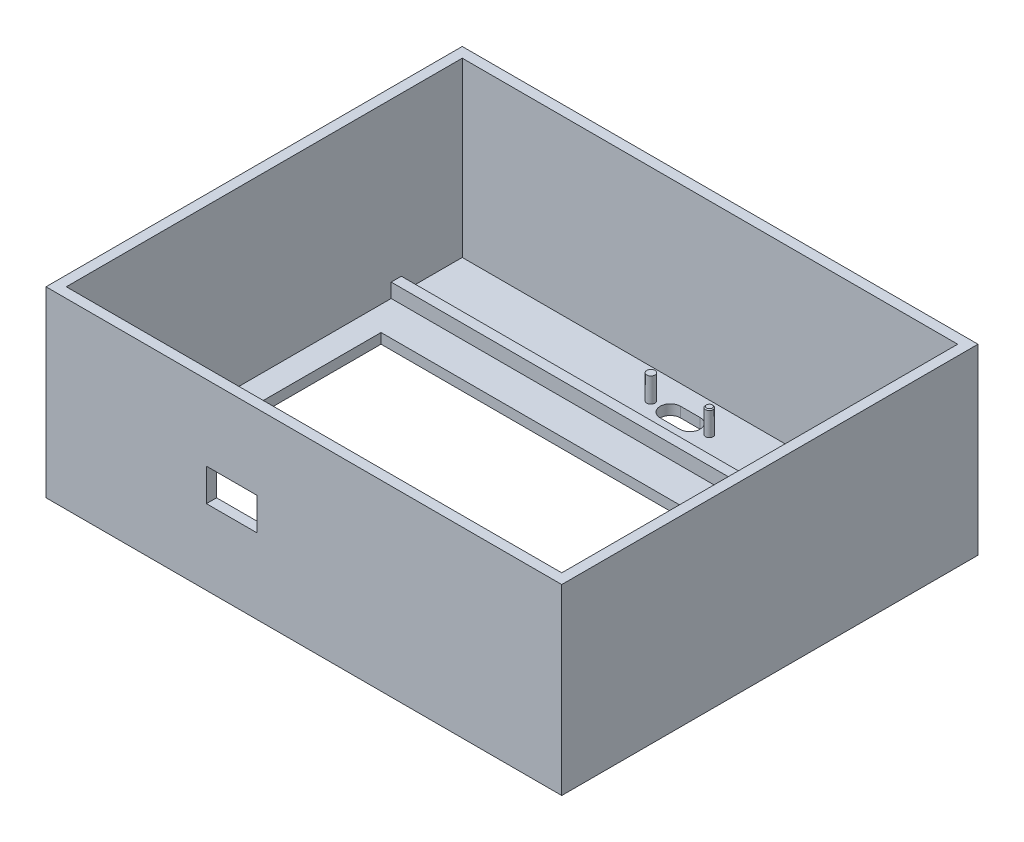
ISO-10303-21;
HEADER;
FILE_DESCRIPTION(('STEP AP214'),'2;1');
FILE_NAME('part.step','',(''),(''),'','','');
FILE_SCHEMA(('AUTOMOTIVE_DESIGN { 1 0 10303 214 1 1 1 1 }'));
ENDSEC;
DATA;
#1=APPLICATION_CONTEXT('core data for automotive mechanical design processes');
#2=APPLICATION_PROTOCOL_DEFINITION('international standard','automotive_design',2000,#1);
#3=PRODUCT_CONTEXT('',#1,'mechanical');
#4=PRODUCT('Part','Part','',(#3));
#5=PRODUCT_RELATED_PRODUCT_CATEGORY('part','',(#4));
#6=PRODUCT_DEFINITION_FORMATION('','',#4);
#7=PRODUCT_DEFINITION_CONTEXT('part definition',#1,'design');
#8=PRODUCT_DEFINITION('design','',#6,#7);
#9=PRODUCT_DEFINITION_SHAPE('','',#8);
#10=(LENGTH_UNIT() NAMED_UNIT(*) SI_UNIT(.MILLI.,.METRE.));
#11=(NAMED_UNIT(*) PLANE_ANGLE_UNIT() SI_UNIT($,.RADIAN.));
#12=(NAMED_UNIT(*) SI_UNIT($,.STERADIAN.) SOLID_ANGLE_UNIT());
#13=UNCERTAINTY_MEASURE_WITH_UNIT(LENGTH_MEASURE(1.E-05),#10,'distance_accuracy_value','');
#14=(GEOMETRIC_REPRESENTATION_CONTEXT(3) GLOBAL_UNCERTAINTY_ASSIGNED_CONTEXT((#13)) GLOBAL_UNIT_ASSIGNED_CONTEXT((#10,
#11,#12)) REPRESENTATION_CONTEXT('',''));
#15=CARTESIAN_POINT('',(0.,0.,0.));
#16=DIRECTION('',(0.,0.,1.));
#17=DIRECTION('',(1.,0.,0.));
#18=AXIS2_PLACEMENT_3D('',#15,#16,#17);
#19=CARTESIAN_POINT('',(0.,2.5,-85.));
#20=DIRECTION('',(0.,0.,1.));
#21=DIRECTION('',(1.,0.,0.));
#22=AXIS2_PLACEMENT_3D('',#19,#20,#21);
#23=PLANE('',#22);
#24=DIRECTION('',(-1.,0.,0.));
#25=VECTOR('',#24,1.);
#26=CARTESIAN_POINT('',(2.5,6.,-85.));
#27=LINE('',#26,#25);
#28=CARTESIAN_POINT('',(124.5,6.,-85.));
#29=VERTEX_POINT('',#28);
#30=CARTESIAN_POINT('',(2.5,6.,-85.));
#31=VERTEX_POINT('',#30);
#32=EDGE_CURVE('E377',#29,#31,#27,.T.);
#33=ORIENTED_EDGE('',*,*,#32,.F.);
#34=DIRECTION('',(0.,1.,0.));
#35=VECTOR('',#34,1.);
#36=CARTESIAN_POINT('',(124.5,41.,-85.));
#37=LINE('',#36,#35);
#38=CARTESIAN_POINT('',(124.5,2.5,-85.));
#39=VERTEX_POINT('',#38);
#40=EDGE_CURVE('E383',#39,#29,#37,.T.);
#41=ORIENTED_EDGE('',*,*,#40,.F.);
#42=DIRECTION('',(1.,0.,0.));
#43=VECTOR('',#42,1.);
#44=CARTESIAN_POINT('',(2.5,2.5,-85.));
#45=LINE('',#44,#43);
#46=CARTESIAN_POINT('',(2.5,2.5,-85.));
#47=VERTEX_POINT('',#46);
#48=EDGE_CURVE('E390',#47,#39,#45,.T.);
#49=ORIENTED_EDGE('',*,*,#48,.F.);
#50=DIRECTION('',(0.,-1.,0.));
#51=VECTOR('',#50,1.);
#52=CARTESIAN_POINT('',(2.5,41.,-85.));
#53=LINE('',#52,#51);
#54=EDGE_CURVE('E380',#31,#47,#53,.T.);
#55=ORIENTED_EDGE('',*,*,#54,.F.);
#56=EDGE_LOOP('',(#33,#41,#49,#55));
#57=FACE_BOUND('',#56,.T.);
#58=ADVANCED_FACE('F37',(#57),#23,.F.);
#59=CARTESIAN_POINT('',(2.5,41.,-82.5));
#60=DIRECTION('',(0.,0.,1.));
#61=DIRECTION('',(1.,0.,0.));
#62=AXIS2_PLACEMENT_3D('',#59,#60,#61);
#63=PLANE('',#62);
#64=DIRECTION('',(0.,-1.,0.));
#65=VECTOR('',#64,1.);
#66=CARTESIAN_POINT('',(124.5,41.,-82.5));
#67=LINE('',#66,#65);
#68=CARTESIAN_POINT('',(124.5,6.,-82.5));
#69=VERTEX_POINT('',#68);
#70=CARTESIAN_POINT('',(124.5,2.5,-82.5));
#71=VERTEX_POINT('',#70);
#72=EDGE_CURVE('E443',#69,#71,#67,.T.);
#73=ORIENTED_EDGE('',*,*,#72,.F.);
#74=DIRECTION('',(1.,0.,0.));
#75=VECTOR('',#74,1.);
#76=CARTESIAN_POINT('',(2.5,6.,-82.5));
#77=LINE('',#76,#75);
#78=CARTESIAN_POINT('',(2.5,6.,-82.5));
#79=VERTEX_POINT('',#78);
#80=EDGE_CURVE('E372',#79,#69,#77,.T.);
#81=ORIENTED_EDGE('',*,*,#80,.F.);
#82=DIRECTION('',(0.,-1.,0.));
#83=VECTOR('',#82,1.);
#84=CARTESIAN_POINT('',(2.5,41.,-82.5));
#85=LINE('',#84,#83);
#86=CARTESIAN_POINT('',(2.5,2.5,-82.5));
#87=VERTEX_POINT('',#86);
#88=EDGE_CURVE('E441',#79,#87,#85,.T.);
#89=ORIENTED_EDGE('',*,*,#88,.T.);
#90=DIRECTION('',(-1.,0.,0.));
#91=VECTOR('',#90,1.);
#92=CARTESIAN_POINT('',(2.5,2.5,-82.5));
#93=LINE('',#92,#91);
#94=EDGE_CURVE('E438',#71,#87,#93,.T.);
#95=ORIENTED_EDGE('',*,*,#94,.F.);
#96=EDGE_LOOP('',(#73,#81,#89,#95));
#97=FACE_BOUND('',#96,.T.);
#98=ADVANCED_FACE('F488',(#97),#63,.T.);
#99=CARTESIAN_POINT('',(0.,2.5,0.));
#100=DIRECTION('',(1.,0.,0.));
#101=DIRECTION('',(0.,0.,-1.));
#102=AXIS2_PLACEMENT_3D('',#99,#100,#101);
#103=PLANE('',#102);
#104=DIRECTION('',(0.,0.,1.));
#105=VECTOR('',#104,1.);
#106=CARTESIAN_POINT('',(0.,0.,0.));
#107=LINE('',#106,#105);
#108=CARTESIAN_POINT('',(0.,0.,-102.5));
#109=VERTEX_POINT('',#108);
#110=CARTESIAN_POINT('',(0.,0.,0.));
#111=VERTEX_POINT('',#110);
#112=EDGE_CURVE('E233',#109,#111,#107,.T.);
#113=ORIENTED_EDGE('',*,*,#112,.T.);
#114=DIRECTION('',(0.,-1.,0.));
#115=VECTOR('',#114,1.);
#116=CARTESIAN_POINT('',(0.,2.5,0.));
#117=LINE('',#116,#115);
#118=CARTESIAN_POINT('',(0.,45.,0.));
#119=VERTEX_POINT('',#118);
#120=EDGE_CURVE('E45',#119,#111,#117,.T.);
#121=ORIENTED_EDGE('',*,*,#120,.F.);
#122=DIRECTION('',(0.,0.,1.));
#123=VECTOR('',#122,1.);
#124=CARTESIAN_POINT('',(0.,45.,0.));
#125=LINE('',#124,#123);
#126=CARTESIAN_POINT('',(0.,45.,-102.5));
#127=VERTEX_POINT('',#126);
#128=EDGE_CURVE('E255',#127,#119,#125,.T.);
#129=ORIENTED_EDGE('',*,*,#128,.F.);
#130=DIRECTION('',(0.,1.,0.));
#131=VECTOR('',#130,1.);
#132=CARTESIAN_POINT('',(0.,0.,-102.5));
#133=LINE('',#132,#131);
#134=EDGE_CURVE('E356',#109,#127,#133,.T.);
#135=ORIENTED_EDGE('',*,*,#134,.F.);
#136=EDGE_LOOP('',(#113,#121,#129,#135));
#137=FACE_BOUND('',#136,.T.);
#138=ADVANCED_FACE('F39',(#137),#103,.F.);
#139=CARTESIAN_POINT('',(0.,2.5,0.));
#140=DIRECTION('',(0.,0.,-1.));
#141=DIRECTION('',(-1.,0.,0.));
#142=AXIS2_PLACEMENT_3D('',#139,#140,#141);
#143=PLANE('',#142);
#144=DIRECTION('',(1.,0.,0.));
#145=VECTOR('',#144,1.);
#146=CARTESIAN_POINT('',(39.5,18.5,0.));
#147=LINE('',#146,#145);
#148=CARTESIAN_POINT('',(39.5,18.5,0.));
#149=VERTEX_POINT('',#148);
#150=CARTESIAN_POINT('',(52.,18.5,0.));
#151=VERTEX_POINT('',#150);
#152=EDGE_CURVE('E280',#149,#151,#147,.T.);
#153=ORIENTED_EDGE('',*,*,#152,.F.);
#154=DIRECTION('',(0.,-1.,0.));
#155=VECTOR('',#154,1.);
#156=CARTESIAN_POINT('',(39.5,26.5,0.));
#157=LINE('',#156,#155);
#158=CARTESIAN_POINT('',(39.5,26.5,0.));
#159=VERTEX_POINT('',#158);
#160=EDGE_CURVE('E52',#159,#149,#157,.T.);
#161=ORIENTED_EDGE('',*,*,#160,.F.);
#162=DIRECTION('',(-1.,0.,0.));
#163=VECTOR('',#162,1.);
#164=CARTESIAN_POINT('',(39.5,26.5,0.));
#165=LINE('',#164,#163);
#166=CARTESIAN_POINT('',(52.,26.5,0.));
#167=VERTEX_POINT('',#166);
#168=EDGE_CURVE('E271',#167,#159,#165,.T.);
#169=ORIENTED_EDGE('',*,*,#168,.F.);
#170=DIRECTION('',(0.,1.,0.));
#171=VECTOR('',#170,1.);
#172=CARTESIAN_POINT('',(52.,26.5,0.));
#173=LINE('',#172,#171);
#174=EDGE_CURVE('E283',#151,#167,#173,.T.);
#175=ORIENTED_EDGE('',*,*,#174,.F.);
#176=EDGE_LOOP('',(#153,#161,#169,#175));
#177=FACE_BOUND('',#176,.T.);
#178=DIRECTION('',(1.,0.,0.));
#179=VECTOR('',#178,1.);
#180=CARTESIAN_POINT('',(0.,0.,0.));
#181=LINE('',#180,#179);
#182=CARTESIAN_POINT('',(127.,0.,0.));
#183=VERTEX_POINT('',#182);
#184=EDGE_CURVE('E448',#111,#183,#181,.T.);
#185=ORIENTED_EDGE('',*,*,#184,.T.);
#186=DIRECTION('',(0.,-1.,0.));
#187=VECTOR('',#186,1.);
#188=CARTESIAN_POINT('',(127.,2.5,0.));
#189=LINE('',#188,#187);
#190=CARTESIAN_POINT('',(127.,45.,0.));
#191=VERTEX_POINT('',#190);
#192=EDGE_CURVE('E452',#191,#183,#189,.T.);
#193=ORIENTED_EDGE('',*,*,#192,.F.);
#194=DIRECTION('',(1.,0.,0.));
#195=VECTOR('',#194,1.);
#196=CARTESIAN_POINT('',(127.,45.,0.));
#197=LINE('',#196,#195);
#198=EDGE_CURVE('E258',#119,#191,#197,.T.);
#199=ORIENTED_EDGE('',*,*,#198,.F.);
#200=ORIENTED_EDGE('',*,*,#120,.T.);
#201=EDGE_LOOP('',(#185,#193,#199,#200));
#202=FACE_BOUND('',#201,.T.);
#203=ADVANCED_FACE('F457',(#177,#202),#143,.F.);
#204=CARTESIAN_POINT('',(127.,2.5,0.));
#205=DIRECTION('',(-1.,0.,0.));
#206=DIRECTION('',(0.,0.,1.));
#207=AXIS2_PLACEMENT_3D('',#204,#205,#206);
#208=PLANE('',#207);
#209=DIRECTION('',(0.,0.,-1.));
#210=VECTOR('',#209,1.);
#211=CARTESIAN_POINT('',(127.,0.,0.));
#212=LINE('',#211,#210);
#213=CARTESIAN_POINT('',(127.,0.,-102.5));
#214=VERTEX_POINT('',#213);
#215=EDGE_CURVE('E450',#183,#214,#212,.T.);
#216=ORIENTED_EDGE('',*,*,#215,.T.);
#217=DIRECTION('',(0.,-1.,0.));
#218=VECTOR('',#217,1.);
#219=CARTESIAN_POINT('',(127.,0.,-102.5));
#220=LINE('',#219,#218);
#221=CARTESIAN_POINT('',(127.,45.,-102.5));
#222=VERTEX_POINT('',#221);
#223=EDGE_CURVE('E364',#222,#214,#220,.T.);
#224=ORIENTED_EDGE('',*,*,#223,.F.);
#225=DIRECTION('',(0.,0.,-1.));
#226=VECTOR('',#225,1.);
#227=CARTESIAN_POINT('',(127.,45.,-102.5));
#228=LINE('',#227,#226);
#229=EDGE_CURVE('E261',#191,#222,#228,.T.);
#230=ORIENTED_EDGE('',*,*,#229,.F.);
#231=ORIENTED_EDGE('',*,*,#192,.T.);
#232=EDGE_LOOP('',(#216,#224,#230,#231));
#233=FACE_BOUND('',#232,.T.);
#234=ADVANCED_FACE('F470',(#233),#208,.F.);
#235=CARTESIAN_POINT('',(0.,0.,0.));
#236=DIRECTION('',(0.,-1.,0.));
#237=DIRECTION('',(0.,0.,-1.));
#238=AXIS2_PLACEMENT_3D('',#235,#236,#237);
#239=PLANE('',#238);
#240=CARTESIAN_POINT('',(61.1,0.,-92.6537130715805));
#241=DIRECTION('',(0.,-1.,0.));
#242=DIRECTION('',(0.,0.,-1.));
#243=AXIS2_PLACEMENT_3D('',#240,#241,#242);
#244=CIRCLE('',#243,2.5);
#245=CARTESIAN_POINT('',(61.1,0.,-90.1537130715805));
#246=VERTEX_POINT('',#245);
#247=CARTESIAN_POINT('',(61.1,0.,-95.1537130715805));
#248=VERTEX_POINT('',#247);
#249=EDGE_CURVE('E324',#246,#248,#244,.T.);
#250=ORIENTED_EDGE('',*,*,#249,.F.);
#251=DIRECTION('',(-1.,0.,0.));
#252=VECTOR('',#251,1.);
#253=CARTESIAN_POINT('',(61.1,0.,-90.1537130715805));
#254=LINE('',#253,#252);
#255=CARTESIAN_POINT('',(65.9,0.,-90.1537130715805));
#256=VERTEX_POINT('',#255);
#257=EDGE_CURVE('E335',#256,#246,#254,.T.);
#258=ORIENTED_EDGE('',*,*,#257,.F.);
#259=CARTESIAN_POINT('',(65.9,0.,-92.6537130715805));
#260=DIRECTION('',(0.,-1.,0.));
#261=DIRECTION('',(0.,0.,-1.));
#262=AXIS2_PLACEMENT_3D('',#259,#260,#261);
#263=CIRCLE('',#262,2.5);
#264=CARTESIAN_POINT('',(65.9,0.,-95.1537130715805));
#265=VERTEX_POINT('',#264);
#266=EDGE_CURVE('E349',#265,#256,#263,.T.);
#267=ORIENTED_EDGE('',*,*,#266,.F.);
#268=DIRECTION('',(1.,0.,0.));
#269=VECTOR('',#268,1.);
#270=CARTESIAN_POINT('',(61.1,0.,-95.1537130715805));
#271=LINE('',#270,#269);
#272=EDGE_CURVE('E346',#248,#265,#271,.T.);
#273=ORIENTED_EDGE('',*,*,#272,.F.);
#274=EDGE_LOOP('',(#250,#258,#267,#273));
#275=FACE_BOUND('',#274,.T.);
#276=DIRECTION('',(0.,0.,-1.));
#277=VECTOR('',#276,1.);
#278=CARTESIAN_POINT('',(8.50000000000001,0.,-5.5));
#279=LINE('',#278,#277);
#280=CARTESIAN_POINT('',(8.50000000000001,0.,-5.5));
#281=VERTEX_POINT('',#280);
#282=CARTESIAN_POINT('',(8.50000000000001,0.,-74.));
#283=VERTEX_POINT('',#282);
#284=EDGE_CURVE('E400',#281,#283,#279,.T.);
#285=ORIENTED_EDGE('',*,*,#284,.F.);
#286=DIRECTION('',(-1.,0.,0.));
#287=VECTOR('',#286,1.);
#288=CARTESIAN_POINT('',(8.50000000000001,0.,-5.5));
#289=LINE('',#288,#287);
#290=CARTESIAN_POINT('',(118.5,0.,-5.49999999999999));
#291=VERTEX_POINT('',#290);
#292=EDGE_CURVE('E405',#291,#281,#289,.T.);
#293=ORIENTED_EDGE('',*,*,#292,.F.);
#294=DIRECTION('',(0.,0.,1.));
#295=VECTOR('',#294,1.);
#296=CARTESIAN_POINT('',(118.5,0.,-5.49999999999999));
#297=LINE('',#296,#295);
#298=CARTESIAN_POINT('',(118.5,0.,-74.));
#299=VERTEX_POINT('',#298);
#300=EDGE_CURVE('E419',#299,#291,#297,.T.);
#301=ORIENTED_EDGE('',*,*,#300,.F.);
#302=DIRECTION('',(1.,0.,0.));
#303=VECTOR('',#302,1.);
#304=CARTESIAN_POINT('',(8.50000000000001,0.,-74.));
#305=LINE('',#304,#303);
#306=EDGE_CURVE('E416',#283,#299,#305,.T.);
#307=ORIENTED_EDGE('',*,*,#306,.F.);
#308=EDGE_LOOP('',(#285,#293,#301,#307));
#309=FACE_BOUND('',#308,.T.);
#310=ORIENTED_EDGE('',*,*,#112,.F.);
#311=DIRECTION('',(-1.,0.,0.));
#312=VECTOR('',#311,1.);
#313=CARTESIAN_POINT('',(0.,0.,-102.5));
#314=LINE('',#313,#312);
#315=EDGE_CURVE('E367',#214,#109,#314,.T.);
#316=ORIENTED_EDGE('',*,*,#315,.F.);
#317=ORIENTED_EDGE('',*,*,#215,.F.);
#318=ORIENTED_EDGE('',*,*,#184,.F.);
#319=EDGE_LOOP('',(#310,#316,#317,#318));
#320=FACE_BOUND('',#319,.T.);
#321=ADVANCED_FACE('F463',(#275,#309,#320),#239,.T.);
#322=CARTESIAN_POINT('',(2.5,41.,-82.5));
#323=DIRECTION('',(1.,0.,0.));
#324=DIRECTION('',(0.,0.,-1.));
#325=AXIS2_PLACEMENT_3D('',#322,#323,#324);
#326=PLANE('',#325);
#327=DIRECTION('',(0.,0.,1.));
#328=VECTOR('',#327,1.);
#329=CARTESIAN_POINT('',(2.5,2.5,-82.5));
#330=LINE('',#329,#328);
#331=CARTESIAN_POINT('',(2.50000000000001,2.5,-2.49999999999998));
#332=VERTEX_POINT('',#331);
#333=EDGE_CURVE('E426',#87,#332,#330,.T.);
#334=ORIENTED_EDGE('',*,*,#333,.F.);
#335=ORIENTED_EDGE('',*,*,#88,.F.);
#336=DIRECTION('',(0.,0.,1.));
#337=VECTOR('',#336,1.);
#338=CARTESIAN_POINT('',(2.5,6.,-85.));
#339=LINE('',#338,#337);
#340=EDGE_CURVE('E370',#31,#79,#339,.T.);
#341=ORIENTED_EDGE('',*,*,#340,.F.);
#342=ORIENTED_EDGE('',*,*,#54,.T.);
#343=DIRECTION('',(0.,0.,1.));
#344=VECTOR('',#343,1.);
#345=CARTESIAN_POINT('',(2.5,2.5,-100.));
#346=LINE('',#345,#344);
#347=CARTESIAN_POINT('',(2.5,2.5,-100.));
#348=VERTEX_POINT('',#347);
#349=EDGE_CURVE('E397',#348,#47,#346,.T.);
#350=ORIENTED_EDGE('',*,*,#349,.F.);
#351=DIRECTION('',(0.,-1.,0.));
#352=VECTOR('',#351,1.);
#353=CARTESIAN_POINT('',(2.5,41.,-100.));
#354=LINE('',#353,#352);
#355=CARTESIAN_POINT('',(2.5,45.,-100.));
#356=VERTEX_POINT('',#355);
#357=EDGE_CURVE('E240',#356,#348,#354,.T.);
#358=ORIENTED_EDGE('',*,*,#357,.F.);
#359=DIRECTION('',(0.,0.,1.));
#360=VECTOR('',#359,1.);
#361=CARTESIAN_POINT('',(2.5,45.,-100.));
#362=LINE('',#361,#360);
#363=CARTESIAN_POINT('',(2.5,45.,-2.49999999999998));
#364=VERTEX_POINT('',#363);
#365=EDGE_CURVE('E237',#356,#364,#362,.T.);
#366=ORIENTED_EDGE('',*,*,#365,.T.);
#367=DIRECTION('',(0.,-1.,0.));
#368=VECTOR('',#367,1.);
#369=CARTESIAN_POINT('',(2.50000000000001,41.,-2.49999999999998));
#370=LINE('',#369,#368);
#371=EDGE_CURVE('E222',#364,#332,#370,.T.);
#372=ORIENTED_EDGE('',*,*,#371,.T.);
#373=EDGE_LOOP('',(#334,#335,#341,#342,#350,#358,#366,#372));
#374=FACE_BOUND('',#373,.T.);
#375=ADVANCED_FACE('F238',(#374),#326,.T.);
#376=CARTESIAN_POINT('',(2.50000000000001,41.,-2.49999999999998));
#377=DIRECTION('',(0.,0.,-1.));
#378=DIRECTION('',(-1.,0.,0.));
#379=AXIS2_PLACEMENT_3D('',#376,#377,#378);
#380=PLANE('',#379);
#381=DIRECTION('',(0.,-1.,0.));
#382=VECTOR('',#381,1.);
#383=CARTESIAN_POINT('',(39.5,26.5,-2.5));
#384=LINE('',#383,#382);
#385=CARTESIAN_POINT('',(39.5,26.5,-2.5));
#386=VERTEX_POINT('',#385);
#387=CARTESIAN_POINT('',(39.5,18.5,-2.5));
#388=VERTEX_POINT('',#387);
#389=EDGE_CURVE('E267',#386,#388,#384,.T.);
#390=ORIENTED_EDGE('',*,*,#389,.T.);
#391=DIRECTION('',(1.,0.,0.));
#392=VECTOR('',#391,1.);
#393=CARTESIAN_POINT('',(39.5,18.5,-2.5));
#394=LINE('',#393,#392);
#395=CARTESIAN_POINT('',(52.,18.5,-2.49999999999998));
#396=VERTEX_POINT('',#395);
#397=EDGE_CURVE('E270',#388,#396,#394,.T.);
#398=ORIENTED_EDGE('',*,*,#397,.T.);
#399=DIRECTION('',(0.,1.,0.));
#400=VECTOR('',#399,1.);
#401=CARTESIAN_POINT('',(52.,26.5,-2.5));
#402=LINE('',#401,#400);
#403=CARTESIAN_POINT('',(52.,26.5,-2.5));
#404=VERTEX_POINT('',#403);
#405=EDGE_CURVE('E60',#396,#404,#402,.T.);
#406=ORIENTED_EDGE('',*,*,#405,.T.);
#407=DIRECTION('',(-1.,0.,0.));
#408=VECTOR('',#407,1.);
#409=CARTESIAN_POINT('',(39.5,26.5,-2.5));
#410=LINE('',#409,#408);
#411=EDGE_CURVE('E275',#404,#386,#410,.T.);
#412=ORIENTED_EDGE('',*,*,#411,.T.);
#413=EDGE_LOOP('',(#390,#398,#406,#412));
#414=FACE_BOUND('',#413,.T.);
#415=DIRECTION('',(1.,0.,0.));
#416=VECTOR('',#415,1.);
#417=CARTESIAN_POINT('',(2.50000000000001,2.5,-2.49999999999998));
#418=LINE('',#417,#416);
#419=CARTESIAN_POINT('',(124.5,2.5,-2.49999999999998));
#420=VERTEX_POINT('',#419);
#421=EDGE_CURVE('E229',#332,#420,#418,.T.);
#422=ORIENTED_EDGE('',*,*,#421,.F.);
#423=ORIENTED_EDGE('',*,*,#371,.F.);
#424=DIRECTION('',(1.,0.,0.));
#425=VECTOR('',#424,1.);
#426=CARTESIAN_POINT('',(2.5,45.,-2.49999999999998));
#427=LINE('',#426,#425);
#428=CARTESIAN_POINT('',(124.5,45.,-2.49999999999998));
#429=VERTEX_POINT('',#428);
#430=EDGE_CURVE('E226',#364,#429,#427,.T.);
#431=ORIENTED_EDGE('',*,*,#430,.T.);
#432=DIRECTION('',(0.,-1.,0.));
#433=VECTOR('',#432,1.);
#434=CARTESIAN_POINT('',(124.5,41.,-2.49999999999998));
#435=LINE('',#434,#433);
#436=EDGE_CURVE('E234',#429,#420,#435,.T.);
#437=ORIENTED_EDGE('',*,*,#436,.T.);
#438=EDGE_LOOP('',(#422,#423,#431,#437));
#439=FACE_BOUND('',#438,.T.);
#440=ADVANCED_FACE('F224',(#414,#439),#380,.T.);
#441=CARTESIAN_POINT('',(124.5,41.,-82.5));
#442=DIRECTION('',(-1.,0.,0.));
#443=DIRECTION('',(0.,0.,1.));
#444=AXIS2_PLACEMENT_3D('',#441,#442,#443);
#445=PLANE('',#444);
#446=DIRECTION('',(0.,0.,-1.));
#447=VECTOR('',#446,1.);
#448=CARTESIAN_POINT('',(124.5,2.5,-82.5));
#449=LINE('',#448,#447);
#450=EDGE_CURVE('E435',#420,#71,#449,.T.);
#451=ORIENTED_EDGE('',*,*,#450,.F.);
#452=ORIENTED_EDGE('',*,*,#436,.F.);
#453=DIRECTION('',(0.,0.,-1.));
#454=VECTOR('',#453,1.);
#455=CARTESIAN_POINT('',(124.5,45.,-100.));
#456=LINE('',#455,#454);
#457=CARTESIAN_POINT('',(124.5,45.,-100.));
#458=VERTEX_POINT('',#457);
#459=EDGE_CURVE('E248',#429,#458,#456,.T.);
#460=ORIENTED_EDGE('',*,*,#459,.T.);
#461=DIRECTION('',(0.,1.,0.));
#462=VECTOR('',#461,1.);
#463=CARTESIAN_POINT('',(124.5,41.,-100.));
#464=LINE('',#463,#462);
#465=CARTESIAN_POINT('',(124.5,2.5,-100.));
#466=VERTEX_POINT('',#465);
#467=EDGE_CURVE('E386',#466,#458,#464,.T.);
#468=ORIENTED_EDGE('',*,*,#467,.F.);
#469=DIRECTION('',(0.,0.,1.));
#470=VECTOR('',#469,1.);
#471=CARTESIAN_POINT('',(124.5,2.5,-100.));
#472=LINE('',#471,#470);
#473=EDGE_CURVE('E388',#466,#39,#472,.T.);
#474=ORIENTED_EDGE('',*,*,#473,.T.);
#475=ORIENTED_EDGE('',*,*,#40,.T.);
#476=DIRECTION('',(0.,0.,-1.));
#477=VECTOR('',#476,1.);
#478=CARTESIAN_POINT('',(124.5,6.,-85.));
#479=LINE('',#478,#477);
#480=EDGE_CURVE('E375',#69,#29,#479,.T.);
#481=ORIENTED_EDGE('',*,*,#480,.F.);
#482=ORIENTED_EDGE('',*,*,#72,.T.);
#483=EDGE_LOOP('',(#451,#452,#460,#468,#474,#475,#481,#482));
#484=FACE_BOUND('',#483,.T.);
#485=ADVANCED_FACE('F603',(#484),#445,.T.);
#486=CARTESIAN_POINT('',(0.,2.5,0.));
#487=DIRECTION('',(0.,-1.,0.));
#488=DIRECTION('',(0.,0.,-1.));
#489=AXIS2_PLACEMENT_3D('',#486,#487,#488);
#490=PLANE('',#489);
#491=DIRECTION('',(-1.,0.,0.));
#492=VECTOR('',#491,1.);
#493=CARTESIAN_POINT('',(8.50000000000001,2.5,-5.5));
#494=LINE('',#493,#492);
#495=CARTESIAN_POINT('',(118.5,2.5,-5.49999999999999));
#496=VERTEX_POINT('',#495);
#497=CARTESIAN_POINT('',(8.50000000000001,2.5,-5.5));
#498=VERTEX_POINT('',#497);
#499=EDGE_CURVE('E411',#496,#498,#494,.T.);
#500=ORIENTED_EDGE('',*,*,#499,.T.);
#501=DIRECTION('',(0.,0.,-1.));
#502=VECTOR('',#501,1.);
#503=CARTESIAN_POINT('',(8.50000000000001,2.5,-5.5));
#504=LINE('',#503,#502);
#505=CARTESIAN_POINT('',(8.50000000000001,2.5,-74.));
#506=VERTEX_POINT('',#505);
#507=EDGE_CURVE('E401',#498,#506,#504,.T.);
#508=ORIENTED_EDGE('',*,*,#507,.T.);
#509=DIRECTION('',(1.,0.,0.));
#510=VECTOR('',#509,1.);
#511=CARTESIAN_POINT('',(8.50000000000001,2.5,-74.));
#512=LINE('',#511,#510);
#513=CARTESIAN_POINT('',(118.5,2.5,-74.));
#514=VERTEX_POINT('',#513);
#515=EDGE_CURVE('E404',#506,#514,#512,.T.);
#516=ORIENTED_EDGE('',*,*,#515,.T.);
#517=DIRECTION('',(0.,0.,1.));
#518=VECTOR('',#517,1.);
#519=CARTESIAN_POINT('',(118.5,2.5,-5.49999999999999));
#520=LINE('',#519,#518);
#521=EDGE_CURVE('E408',#514,#496,#520,.T.);
#522=ORIENTED_EDGE('',*,*,#521,.T.);
#523=EDGE_LOOP('',(#500,#508,#516,#522));
#524=FACE_BOUND('',#523,.T.);
#525=ORIENTED_EDGE('',*,*,#94,.T.);
#526=ORIENTED_EDGE('',*,*,#333,.T.);
#527=ORIENTED_EDGE('',*,*,#421,.T.);
#528=ORIENTED_EDGE('',*,*,#450,.T.);
#529=EDGE_LOOP('',(#525,#526,#527,#528));
#530=FACE_BOUND('',#529,.T.);
#531=ADVANCED_FACE('F600',(#524,#530),#490,.F.);
#532=CARTESIAN_POINT('',(8.50000000000001,2.5,-5.5));
#533=DIRECTION('',(-1.,0.,0.));
#534=DIRECTION('',(0.,0.,1.));
#535=AXIS2_PLACEMENT_3D('',#532,#533,#534);
#536=PLANE('',#535);
#537=ORIENTED_EDGE('',*,*,#284,.T.);
#538=DIRECTION('',(0.,-1.,0.));
#539=VECTOR('',#538,1.);
#540=CARTESIAN_POINT('',(8.50000000000001,2.5,-74.));
#541=LINE('',#540,#539);
#542=EDGE_CURVE('E414',#506,#283,#541,.T.);
#543=ORIENTED_EDGE('',*,*,#542,.F.);
#544=ORIENTED_EDGE('',*,*,#507,.F.);
#545=DIRECTION('',(0.,-1.,0.));
#546=VECTOR('',#545,1.);
#547=CARTESIAN_POINT('',(8.50000000000001,2.5,-5.5));
#548=LINE('',#547,#546);
#549=EDGE_CURVE('E424',#498,#281,#548,.T.);
#550=ORIENTED_EDGE('',*,*,#549,.T.);
#551=EDGE_LOOP('',(#537,#543,#544,#550));
#552=FACE_BOUND('',#551,.T.);
#553=ADVANCED_FACE('F591',(#552),#536,.F.);
#554=CARTESIAN_POINT('',(8.50000000000001,2.5,-5.5));
#555=DIRECTION('',(0.,0.,1.));
#556=DIRECTION('',(1.,0.,0.));
#557=AXIS2_PLACEMENT_3D('',#554,#555,#556);
#558=PLANE('',#557);
#559=ORIENTED_EDGE('',*,*,#292,.T.);
#560=ORIENTED_EDGE('',*,*,#549,.F.);
#561=ORIENTED_EDGE('',*,*,#499,.F.);
#562=DIRECTION('',(0.,-1.,0.));
#563=VECTOR('',#562,1.);
#564=CARTESIAN_POINT('',(118.5,2.5,-5.49999999999999));
#565=LINE('',#564,#563);
#566=EDGE_CURVE('E427',#496,#291,#565,.T.);
#567=ORIENTED_EDGE('',*,*,#566,.T.);
#568=EDGE_LOOP('',(#559,#560,#561,#567));
#569=FACE_BOUND('',#568,.T.);
#570=ADVANCED_FACE('F587',(#569),#558,.F.);
#571=CARTESIAN_POINT('',(118.5,2.5,-5.49999999999999));
#572=DIRECTION('',(1.,0.,0.));
#573=DIRECTION('',(0.,0.,-1.));
#574=AXIS2_PLACEMENT_3D('',#571,#572,#573);
#575=PLANE('',#574);
#576=ORIENTED_EDGE('',*,*,#300,.T.);
#577=ORIENTED_EDGE('',*,*,#566,.F.);
#578=ORIENTED_EDGE('',*,*,#521,.F.);
#579=DIRECTION('',(0.,-1.,0.));
#580=VECTOR('',#579,1.);
#581=CARTESIAN_POINT('',(118.5,2.5,-74.));
#582=LINE('',#581,#580);
#583=EDGE_CURVE('E429',#514,#299,#582,.T.);
#584=ORIENTED_EDGE('',*,*,#583,.T.);
#585=EDGE_LOOP('',(#576,#577,#578,#584));
#586=FACE_BOUND('',#585,.T.);
#587=ADVANCED_FACE('F590',(#586),#575,.F.);
#588=CARTESIAN_POINT('',(8.50000000000001,2.5,-74.));
#589=DIRECTION('',(0.,0.,-1.));
#590=DIRECTION('',(-1.,0.,0.));
#591=AXIS2_PLACEMENT_3D('',#588,#589,#590);
#592=PLANE('',#591);
#593=ORIENTED_EDGE('',*,*,#306,.T.);
#594=ORIENTED_EDGE('',*,*,#583,.F.);
#595=ORIENTED_EDGE('',*,*,#515,.F.);
#596=ORIENTED_EDGE('',*,*,#542,.T.);
#597=EDGE_LOOP('',(#593,#594,#595,#596));
#598=FACE_BOUND('',#597,.T.);
#599=ADVANCED_FACE('F585',(#598),#592,.F.);
#600=CARTESIAN_POINT('',(2.5,2.5,-100.));
#601=DIRECTION('',(0.,-1.,0.));
#602=DIRECTION('',(1.,0.,0.));
#603=AXIS2_PLACEMENT_3D('',#600,#601,#602);
#604=PLANE('',#603);
#605=CARTESIAN_POINT('',(56.3,2.5,-92.6537130715805));
#606=DIRECTION('',(0.,-1.,0.));
#607=DIRECTION('',(1.,0.,0.));
#608=AXIS2_PLACEMENT_3D('',#605,#606,#607);
#609=CIRCLE('',#608,0.999999999999998);
#610=CARTESIAN_POINT('',(57.3,2.5,-92.6537130715805));
#611=VERTEX_POINT('',#610);
#612=EDGE_CURVE('E11',#611,#611,#609,.F.);
#613=ORIENTED_EDGE('',*,*,#612,.F.);
#614=EDGE_LOOP('',(#613));
#615=FACE_BOUND('',#614,.T.);
#616=DIRECTION('',(1.,0.,0.));
#617=VECTOR('',#616,1.);
#618=CARTESIAN_POINT('',(56.,2.5,-86.1537130715805));
#619=LINE('',#618,#617);
#620=CARTESIAN_POINT('',(56.,2.5,-86.1537130715805));
#621=VERTEX_POINT('',#620);
#622=CARTESIAN_POINT('',(71.,2.5,-86.1537130715805));
#623=VERTEX_POINT('',#622);
#624=EDGE_CURVE('E314',#621,#623,#619,.T.);
#625=ORIENTED_EDGE('',*,*,#624,.F.);
#626=DIRECTION('',(0.,0.,1.));
#627=VECTOR('',#626,1.);
#628=CARTESIAN_POINT('',(56.,2.5,-87.1537130715805));
#629=LINE('',#628,#627);
#630=CARTESIAN_POINT('',(56.,2.5,-87.1537130715805));
#631=VERTEX_POINT('',#630);
#632=EDGE_CURVE('E298',#631,#621,#629,.T.);
#633=ORIENTED_EDGE('',*,*,#632,.F.);
#634=DIRECTION('',(-1.,0.,0.));
#635=VECTOR('',#634,1.);
#636=CARTESIAN_POINT('',(56.,2.5,-87.1537130715805));
#637=LINE('',#636,#635);
#638=CARTESIAN_POINT('',(71.,2.5,-87.1537130715805));
#639=VERTEX_POINT('',#638);
#640=EDGE_CURVE('E303',#639,#631,#637,.T.);
#641=ORIENTED_EDGE('',*,*,#640,.F.);
#642=DIRECTION('',(0.,0.,-1.));
#643=VECTOR('',#642,1.);
#644=CARTESIAN_POINT('',(71.,2.5,-87.1537130715805));
#645=LINE('',#644,#643);
#646=EDGE_CURVE('E317',#623,#639,#645,.T.);
#647=ORIENTED_EDGE('',*,*,#646,.F.);
#648=EDGE_LOOP('',(#625,#633,#641,#647));
#649=FACE_BOUND('',#648,.T.);
#650=DIRECTION('',(-1.,0.,0.));
#651=VECTOR('',#650,1.);
#652=CARTESIAN_POINT('',(61.1,2.5,-90.1537130715805));
#653=LINE('',#652,#651);
#654=CARTESIAN_POINT('',(65.9,2.5,-90.1537130715805));
#655=VERTEX_POINT('',#654);
#656=CARTESIAN_POINT('',(61.1,2.5,-90.1537130715805));
#657=VERTEX_POINT('',#656);
#658=EDGE_CURVE('E341',#655,#657,#653,.T.);
#659=ORIENTED_EDGE('',*,*,#658,.T.);
#660=CARTESIAN_POINT('',(61.1,2.5,-92.6537130715805));
#661=DIRECTION('',(0.,-1.,0.));
#662=DIRECTION('',(0.,0.,-1.));
#663=AXIS2_PLACEMENT_3D('',#660,#661,#662);
#664=CIRCLE('',#663,2.5);
#665=CARTESIAN_POINT('',(61.1,2.5,-95.1537130715805));
#666=VERTEX_POINT('',#665);
#667=EDGE_CURVE('E331',#657,#666,#664,.T.);
#668=ORIENTED_EDGE('',*,*,#667,.T.);
#669=DIRECTION('',(1.,0.,0.));
#670=VECTOR('',#669,1.);
#671=CARTESIAN_POINT('',(61.1,2.5,-95.1537130715805));
#672=LINE('',#671,#670);
#673=CARTESIAN_POINT('',(65.9,2.5,-95.1537130715805));
#674=VERTEX_POINT('',#673);
#675=EDGE_CURVE('E334',#666,#674,#672,.T.);
#676=ORIENTED_EDGE('',*,*,#675,.T.);
#677=CARTESIAN_POINT('',(65.9,2.5,-92.6537130715805));
#678=DIRECTION('',(0.,-1.,0.));
#679=DIRECTION('',(0.,0.,-1.));
#680=AXIS2_PLACEMENT_3D('',#677,#678,#679);
#681=CIRCLE('',#680,2.5);
#682=EDGE_CURVE('E338',#674,#655,#681,.T.);
#683=ORIENTED_EDGE('',*,*,#682,.T.);
#684=EDGE_LOOP('',(#659,#668,#676,#683));
#685=FACE_BOUND('',#684,.T.);
#686=ORIENTED_EDGE('',*,*,#48,.T.);
#687=ORIENTED_EDGE('',*,*,#473,.F.);
#688=DIRECTION('',(1.,0.,0.));
#689=VECTOR('',#688,1.);
#690=CARTESIAN_POINT('',(2.5,2.5,-100.));
#691=LINE('',#690,#689);
#692=EDGE_CURVE('E382',#348,#466,#691,.T.);
#693=ORIENTED_EDGE('',*,*,#692,.F.);
#694=ORIENTED_EDGE('',*,*,#349,.T.);
#695=EDGE_LOOP('',(#686,#687,#693,#694));
#696=FACE_BOUND('',#695,.T.);
#697=CARTESIAN_POINT('',(70.7,2.5,-92.6537130715805));
#698=DIRECTION('',(0.,-1.,0.));
#699=DIRECTION('',(0.,0.,-1.));
#700=AXIS2_PLACEMENT_3D('',#697,#698,#699);
#701=CIRCLE('',#700,0.9271);
#702=CARTESIAN_POINT('',(70.7,2.5,-93.5808130715805));
#703=VERTEX_POINT('',#702);
#704=EDGE_CURVE('E244',#703,#703,#701,.T.);
#705=ORIENTED_EDGE('',*,*,#704,.T.);
#706=EDGE_LOOP('',(#705));
#707=FACE_BOUND('',#706,.T.);
#708=ADVANCED_FACE('F581',(#615,#649,#685,#696,#707),#604,.F.);
#709=CARTESIAN_POINT('',(0.,6.,0.));
#710=DIRECTION('',(0.,1.,0.));
#711=DIRECTION('',(0.,0.,1.));
#712=AXIS2_PLACEMENT_3D('',#709,#710,#711);
#713=PLANE('',#712);
#714=ORIENTED_EDGE('',*,*,#340,.T.);
#715=ORIENTED_EDGE('',*,*,#80,.T.);
#716=ORIENTED_EDGE('',*,*,#480,.T.);
#717=ORIENTED_EDGE('',*,*,#32,.T.);
#718=EDGE_LOOP('',(#714,#715,#716,#717));
#719=FACE_BOUND('',#718,.T.);
#720=ADVANCED_FACE('F577',(#719),#713,.T.);
#721=CARTESIAN_POINT('',(0.,0.,-100.));
#722=DIRECTION('',(0.,0.,-1.));
#723=DIRECTION('',(-1.,0.,0.));
#724=AXIS2_PLACEMENT_3D('',#721,#722,#723);
#725=PLANE('',#724);
#726=ORIENTED_EDGE('',*,*,#467,.T.);
#727=DIRECTION('',(-1.,0.,0.));
#728=VECTOR('',#727,1.);
#729=CARTESIAN_POINT('',(2.5,45.,-100.));
#730=LINE('',#729,#728);
#731=EDGE_CURVE('E250',#458,#356,#730,.T.);
#732=ORIENTED_EDGE('',*,*,#731,.T.);
#733=ORIENTED_EDGE('',*,*,#357,.T.);
#734=ORIENTED_EDGE('',*,*,#692,.T.);
#735=EDGE_LOOP('',(#726,#732,#733,#734));
#736=FACE_BOUND('',#735,.T.);
#737=ADVANCED_FACE('F574',(#736),#725,.F.);
#738=CARTESIAN_POINT('',(0.,0.,-102.5));
#739=DIRECTION('',(0.,0.,-1.));
#740=DIRECTION('',(-1.,0.,0.));
#741=AXIS2_PLACEMENT_3D('',#738,#739,#740);
#742=PLANE('',#741);
#743=ORIENTED_EDGE('',*,*,#134,.T.);
#744=DIRECTION('',(-1.,0.,0.));
#745=VECTOR('',#744,1.);
#746=CARTESIAN_POINT('',(0.,45.,-102.5));
#747=LINE('',#746,#745);
#748=EDGE_CURVE('E264',#222,#127,#747,.T.);
#749=ORIENTED_EDGE('',*,*,#748,.F.);
#750=ORIENTED_EDGE('',*,*,#223,.T.);
#751=ORIENTED_EDGE('',*,*,#315,.T.);
#752=EDGE_LOOP('',(#743,#749,#750,#751));
#753=FACE_BOUND('',#752,.T.);
#754=ADVANCED_FACE('F466',(#753),#742,.T.);
#755=CARTESIAN_POINT('',(61.1,2.5,-92.6537130715805));
#756=DIRECTION('',(0.,-1.,0.));
#757=DIRECTION('',(0.,0.,-1.));
#758=AXIS2_PLACEMENT_3D('',#755,#756,#757);
#759=CYLINDRICAL_SURFACE('',#758,2.5);
#760=ORIENTED_EDGE('',*,*,#249,.T.);
#761=DIRECTION('',(0.,-1.,0.));
#762=VECTOR('',#761,1.);
#763=CARTESIAN_POINT('',(61.1,2.5,-95.1537130715805));
#764=LINE('',#763,#762);
#765=EDGE_CURVE('E344',#666,#248,#764,.T.);
#766=ORIENTED_EDGE('',*,*,#765,.F.);
#767=ORIENTED_EDGE('',*,*,#667,.F.);
#768=DIRECTION('',(0.,-1.,0.));
#769=VECTOR('',#768,1.);
#770=CARTESIAN_POINT('',(61.1,2.5,-90.1537130715805));
#771=LINE('',#770,#769);
#772=EDGE_CURVE('E354',#657,#246,#771,.T.);
#773=ORIENTED_EDGE('',*,*,#772,.T.);
#774=EDGE_LOOP('',(#760,#766,#767,#773));
#775=FACE_BOUND('',#774,.T.);
#776=ADVANCED_FACE('F561',(#775),#759,.F.);
#777=CARTESIAN_POINT('',(61.1,2.5,-90.1537130715805));
#778=DIRECTION('',(0.,0.,1.));
#779=DIRECTION('',(1.,0.,0.));
#780=AXIS2_PLACEMENT_3D('',#777,#778,#779);
#781=PLANE('',#780);
#782=ORIENTED_EDGE('',*,*,#257,.T.);
#783=ORIENTED_EDGE('',*,*,#772,.F.);
#784=ORIENTED_EDGE('',*,*,#658,.F.);
#785=DIRECTION('',(0.,-1.,0.));
#786=VECTOR('',#785,1.);
#787=CARTESIAN_POINT('',(65.9,2.5,-90.1537130715805));
#788=LINE('',#787,#786);
#789=EDGE_CURVE('E357',#655,#256,#788,.T.);
#790=ORIENTED_EDGE('',*,*,#789,.T.);
#791=EDGE_LOOP('',(#782,#783,#784,#790));
#792=FACE_BOUND('',#791,.T.);
#793=ADVANCED_FACE('F557',(#792),#781,.F.);
#794=CARTESIAN_POINT('',(65.9,2.5,-92.6537130715805));
#795=DIRECTION('',(0.,-1.,0.));
#796=DIRECTION('',(0.,0.,-1.));
#797=AXIS2_PLACEMENT_3D('',#794,#795,#796);
#798=CYLINDRICAL_SURFACE('',#797,2.5);
#799=ORIENTED_EDGE('',*,*,#266,.T.);
#800=ORIENTED_EDGE('',*,*,#789,.F.);
#801=ORIENTED_EDGE('',*,*,#682,.F.);
#802=DIRECTION('',(0.,-1.,0.));
#803=VECTOR('',#802,1.);
#804=CARTESIAN_POINT('',(65.9,2.5,-95.1537130715805));
#805=LINE('',#804,#803);
#806=EDGE_CURVE('E359',#674,#265,#805,.T.);
#807=ORIENTED_EDGE('',*,*,#806,.T.);
#808=EDGE_LOOP('',(#799,#800,#801,#807));
#809=FACE_BOUND('',#808,.T.);
#810=ADVANCED_FACE('F560',(#809),#798,.F.);
#811=CARTESIAN_POINT('',(61.1,2.5,-95.1537130715805));
#812=DIRECTION('',(0.,0.,-1.));
#813=DIRECTION('',(-1.,0.,0.));
#814=AXIS2_PLACEMENT_3D('',#811,#812,#813);
#815=PLANE('',#814);
#816=ORIENTED_EDGE('',*,*,#272,.T.);
#817=ORIENTED_EDGE('',*,*,#806,.F.);
#818=ORIENTED_EDGE('',*,*,#675,.F.);
#819=ORIENTED_EDGE('',*,*,#765,.T.);
#820=EDGE_LOOP('',(#816,#817,#818,#819));
#821=FACE_BOUND('',#820,.T.);
#822=ADVANCED_FACE('F555',(#821),#815,.F.);
#823=CARTESIAN_POINT('',(56.,1.,-87.1537130715805));
#824=DIRECTION('',(-1.,0.,0.));
#825=DIRECTION('',(0.,-1.,0.));
#826=AXIS2_PLACEMENT_3D('',#823,#824,#825);
#827=PLANE('',#826);
#828=ORIENTED_EDGE('',*,*,#632,.T.);
#829=DIRECTION('',(0.,1.,0.));
#830=VECTOR('',#829,1.);
#831=CARTESIAN_POINT('',(56.,1.,-86.1537130715805));
#832=LINE('',#831,#830);
#833=CARTESIAN_POINT('',(56.,1.,-86.1537130715805));
#834=VERTEX_POINT('',#833);
#835=EDGE_CURVE('E312',#834,#621,#832,.T.);
#836=ORIENTED_EDGE('',*,*,#835,.F.);
#837=DIRECTION('',(0.,0.,1.));
#838=VECTOR('',#837,1.);
#839=CARTESIAN_POINT('',(56.,1.,-87.1537130715805));
#840=LINE('',#839,#838);
#841=CARTESIAN_POINT('',(56.,1.,-87.1537130715805));
#842=VERTEX_POINT('',#841);
#843=EDGE_CURVE('E299',#842,#834,#840,.T.);
#844=ORIENTED_EDGE('',*,*,#843,.F.);
#845=DIRECTION('',(0.,1.,0.));
#846=VECTOR('',#845,1.);
#847=CARTESIAN_POINT('',(56.,1.,-87.1537130715805));
#848=LINE('',#847,#846);
#849=EDGE_CURVE('E322',#842,#631,#848,.T.);
#850=ORIENTED_EDGE('',*,*,#849,.T.);
#851=EDGE_LOOP('',(#828,#836,#844,#850));
#852=FACE_BOUND('',#851,.T.);
#853=ADVANCED_FACE('F545',(#852),#827,.F.);
#854=CARTESIAN_POINT('',(56.,1.,-87.1537130715805));
#855=DIRECTION('',(0.,0.,-1.));
#856=DIRECTION('',(-1.,0.,0.));
#857=AXIS2_PLACEMENT_3D('',#854,#855,#856);
#858=PLANE('',#857);
#859=ORIENTED_EDGE('',*,*,#640,.T.);
#860=ORIENTED_EDGE('',*,*,#849,.F.);
#861=DIRECTION('',(-1.,0.,0.));
#862=VECTOR('',#861,1.);
#863=CARTESIAN_POINT('',(56.,1.,-87.1537130715805));
#864=LINE('',#863,#862);
#865=CARTESIAN_POINT('',(71.,1.,-87.1537130715805));
#866=VERTEX_POINT('',#865);
#867=EDGE_CURVE('E309',#866,#842,#864,.T.);
#868=ORIENTED_EDGE('',*,*,#867,.F.);
#869=DIRECTION('',(0.,1.,0.));
#870=VECTOR('',#869,1.);
#871=CARTESIAN_POINT('',(71.,1.,-87.1537130715805));
#872=LINE('',#871,#870);
#873=EDGE_CURVE('E325',#866,#639,#872,.T.);
#874=ORIENTED_EDGE('',*,*,#873,.T.);
#875=EDGE_LOOP('',(#859,#860,#868,#874));
#876=FACE_BOUND('',#875,.T.);
#877=ADVANCED_FACE('F541',(#876),#858,.F.);
#878=CARTESIAN_POINT('',(71.,1.,-87.1537130715805));
#879=DIRECTION('',(1.,0.,0.));
#880=DIRECTION('',(0.,1.,0.));
#881=AXIS2_PLACEMENT_3D('',#878,#879,#880);
#882=PLANE('',#881);
#883=ORIENTED_EDGE('',*,*,#646,.T.);
#884=ORIENTED_EDGE('',*,*,#873,.F.);
#885=DIRECTION('',(0.,0.,-1.));
#886=VECTOR('',#885,1.);
#887=CARTESIAN_POINT('',(71.,1.,-87.1537130715805));
#888=LINE('',#887,#886);
#889=CARTESIAN_POINT('',(71.,1.,-86.1537130715805));
#890=VERTEX_POINT('',#889);
#891=EDGE_CURVE('E306',#890,#866,#888,.T.);
#892=ORIENTED_EDGE('',*,*,#891,.F.);
#893=DIRECTION('',(0.,1.,0.));
#894=VECTOR('',#893,1.);
#895=CARTESIAN_POINT('',(71.,1.,-86.1537130715805));
#896=LINE('',#895,#894);
#897=EDGE_CURVE('E327',#890,#623,#896,.T.);
#898=ORIENTED_EDGE('',*,*,#897,.T.);
#899=EDGE_LOOP('',(#883,#884,#892,#898));
#900=FACE_BOUND('',#899,.T.);
#901=ADVANCED_FACE('F544',(#900),#882,.F.);
#902=CARTESIAN_POINT('',(56.,1.,-86.1537130715805));
#903=DIRECTION('',(0.,0.,1.));
#904=DIRECTION('',(1.,0.,0.));
#905=AXIS2_PLACEMENT_3D('',#902,#903,#904);
#906=PLANE('',#905);
#907=ORIENTED_EDGE('',*,*,#624,.T.);
#908=ORIENTED_EDGE('',*,*,#897,.F.);
#909=DIRECTION('',(1.,0.,0.));
#910=VECTOR('',#909,1.);
#911=CARTESIAN_POINT('',(56.,1.,-86.1537130715805));
#912=LINE('',#911,#910);
#913=EDGE_CURVE('E302',#834,#890,#912,.T.);
#914=ORIENTED_EDGE('',*,*,#913,.F.);
#915=ORIENTED_EDGE('',*,*,#835,.T.);
#916=EDGE_LOOP('',(#907,#908,#914,#915));
#917=FACE_BOUND('',#916,.T.);
#918=ADVANCED_FACE('F539',(#917),#906,.F.);
#919=CARTESIAN_POINT('',(0.,0.999999999999998,0.));
#920=DIRECTION('',(0.,1.,0.));
#921=DIRECTION('',(-1.,0.,0.));
#922=AXIS2_PLACEMENT_3D('',#919,#920,#921);
#923=PLANE('',#922);
#924=ORIENTED_EDGE('',*,*,#843,.T.);
#925=ORIENTED_EDGE('',*,*,#913,.T.);
#926=ORIENTED_EDGE('',*,*,#891,.T.);
#927=ORIENTED_EDGE('',*,*,#867,.T.);
#928=EDGE_LOOP('',(#924,#925,#926,#927));
#929=FACE_BOUND('',#928,.T.);
#930=ADVANCED_FACE('F535',(#929),#923,.T.);
#931=CARTESIAN_POINT('',(56.3,8.5,-92.6537130715805));
#932=DIRECTION('',(0.,-1.,0.));
#933=DIRECTION('',(1.,0.,0.));
#934=AXIS2_PLACEMENT_3D('',#931,#932,#933);
#935=CYLINDRICAL_SURFACE('',#934,0.999999999999998);
#936=CARTESIAN_POINT('',(56.3,8.5,-92.6537130715805));
#937=DIRECTION('',(0.,1.,0.));
#938=DIRECTION('',(-1.,0.,0.));
#939=AXIS2_PLACEMENT_3D('',#936,#937,#938);
#940=CIRCLE('',#939,0.999999999999998);
#941=CARTESIAN_POINT('',(55.3,8.5,-92.6537130715805));
#942=VERTEX_POINT('',#941);
#943=EDGE_CURVE('E290',#942,#942,#940,.T.);
#944=ORIENTED_EDGE('',*,*,#943,.F.);
#945=EDGE_LOOP('',(#944));
#946=FACE_BOUND('',#945,.T.);
#947=ORIENTED_EDGE('',*,*,#612,.T.);
#948=EDGE_LOOP('',(#947));
#949=FACE_BOUND('',#948,.T.);
#950=ADVANCED_FACE('F531',(#946,#949),#935,.T.);
#951=CARTESIAN_POINT('',(56.3,8.5,-92.6537130715805));
#952=DIRECTION('',(0.,1.,0.));
#953=DIRECTION('',(-1.,0.,0.));
#954=AXIS2_PLACEMENT_3D('',#951,#952,#953);
#955=PLANE('',#954);
#956=ORIENTED_EDGE('',*,*,#943,.T.);
#957=EDGE_LOOP('',(#956));
#958=FACE_BOUND('',#957,.T.);
#959=ADVANCED_FACE('F524',(#958),#955,.T.);
#960=CARTESIAN_POINT('',(39.5,26.5,-2.5));
#961=DIRECTION('',(-1.,0.,0.));
#962=DIRECTION('',(0.,0.,1.));
#963=AXIS2_PLACEMENT_3D('',#960,#961,#962);
#964=PLANE('',#963);
#965=ORIENTED_EDGE('',*,*,#160,.T.);
#966=DIRECTION('',(0.,0.,1.));
#967=VECTOR('',#966,1.);
#968=CARTESIAN_POINT('',(39.5,18.5,-2.5));
#969=LINE('',#968,#967);
#970=EDGE_CURVE('E278',#388,#149,#969,.T.);
#971=ORIENTED_EDGE('',*,*,#970,.F.);
#972=ORIENTED_EDGE('',*,*,#389,.F.);
#973=DIRECTION('',(0.,0.,1.));
#974=VECTOR('',#973,1.);
#975=CARTESIAN_POINT('',(39.5,26.5,-2.5));
#976=LINE('',#975,#974);
#977=EDGE_CURVE('E288',#386,#159,#976,.T.);
#978=ORIENTED_EDGE('',*,*,#977,.T.);
#979=EDGE_LOOP('',(#965,#971,#972,#978));
#980=FACE_BOUND('',#979,.T.);
#981=ADVANCED_FACE('F511',(#980),#964,.F.);
#982=CARTESIAN_POINT('',(39.5,26.5,-2.5));
#983=DIRECTION('',(0.,1.,0.));
#984=DIRECTION('',(0.,0.,1.));
#985=AXIS2_PLACEMENT_3D('',#982,#983,#984);
#986=PLANE('',#985);
#987=ORIENTED_EDGE('',*,*,#168,.T.);
#988=ORIENTED_EDGE('',*,*,#977,.F.);
#989=ORIENTED_EDGE('',*,*,#411,.F.);
#990=DIRECTION('',(0.,0.,1.));
#991=VECTOR('',#990,1.);
#992=CARTESIAN_POINT('',(52.,26.5,-2.5));
#993=LINE('',#992,#991);
#994=EDGE_CURVE('E291',#404,#167,#993,.T.);
#995=ORIENTED_EDGE('',*,*,#994,.T.);
#996=EDGE_LOOP('',(#987,#988,#989,#995));
#997=FACE_BOUND('',#996,.T.);
#998=ADVANCED_FACE('F515',(#997),#986,.F.);
#999=CARTESIAN_POINT('',(52.,26.5,-2.5));
#1000=DIRECTION('',(1.,0.,0.));
#1001=DIRECTION('',(0.,0.,-1.));
#1002=AXIS2_PLACEMENT_3D('',#999,#1000,#1001);
#1003=PLANE('',#1002);
#1004=ORIENTED_EDGE('',*,*,#174,.T.);
#1005=ORIENTED_EDGE('',*,*,#994,.F.);
#1006=ORIENTED_EDGE('',*,*,#405,.F.);
#1007=DIRECTION('',(0.,0.,1.));
#1008=VECTOR('',#1007,1.);
#1009=CARTESIAN_POINT('',(52.,18.5,-2.5));
#1010=LINE('',#1009,#1008);
#1011=EDGE_CURVE('E293',#396,#151,#1010,.T.);
#1012=ORIENTED_EDGE('',*,*,#1011,.T.);
#1013=EDGE_LOOP('',(#1004,#1005,#1006,#1012));
#1014=FACE_BOUND('',#1013,.T.);
#1015=ADVANCED_FACE('F483',(#1014),#1003,.F.);
#1016=CARTESIAN_POINT('',(39.5,18.5,-2.5));
#1017=DIRECTION('',(0.,-1.,0.));
#1018=DIRECTION('',(0.,0.,-1.));
#1019=AXIS2_PLACEMENT_3D('',#1016,#1017,#1018);
#1020=PLANE('',#1019);
#1021=ORIENTED_EDGE('',*,*,#152,.T.);
#1022=ORIENTED_EDGE('',*,*,#1011,.F.);
#1023=ORIENTED_EDGE('',*,*,#397,.F.);
#1024=ORIENTED_EDGE('',*,*,#970,.T.);
#1025=EDGE_LOOP('',(#1021,#1022,#1023,#1024));
#1026=FACE_BOUND('',#1025,.T.);
#1027=ADVANCED_FACE('F474',(#1026),#1020,.F.);
#1028=CARTESIAN_POINT('',(0.,45.,0.));
#1029=DIRECTION('',(0.,-1.,0.));
#1030=DIRECTION('',(0.,0.,-1.));
#1031=AXIS2_PLACEMENT_3D('',#1028,#1029,#1030);
#1032=PLANE('',#1031);
#1033=ORIENTED_EDGE('',*,*,#128,.T.);
#1034=ORIENTED_EDGE('',*,*,#198,.T.);
#1035=ORIENTED_EDGE('',*,*,#229,.T.);
#1036=ORIENTED_EDGE('',*,*,#748,.T.);
#1037=EDGE_LOOP('',(#1033,#1034,#1035,#1036));
#1038=FACE_BOUND('',#1037,.T.);
#1039=ORIENTED_EDGE('',*,*,#365,.F.);
#1040=ORIENTED_EDGE('',*,*,#731,.F.);
#1041=ORIENTED_EDGE('',*,*,#459,.F.);
#1042=ORIENTED_EDGE('',*,*,#430,.F.);
#1043=EDGE_LOOP('',(#1039,#1040,#1041,#1042));
#1044=FACE_BOUND('',#1043,.T.);
#1045=ADVANCED_FACE('F246',(#1038,#1044),#1032,.F.);
#1046=CARTESIAN_POINT('',(70.7,8.5,-92.6537130715805));
#1047=DIRECTION('',(0.,-1.,0.));
#1048=DIRECTION('',(0.,0.,-1.));
#1049=AXIS2_PLACEMENT_3D('',#1046,#1047,#1048);
#1050=CYLINDRICAL_SURFACE('',#1049,0.9271);
#1051=ORIENTED_EDGE('',*,*,#704,.F.);
#1052=EDGE_LOOP('',(#1051));
#1053=FACE_BOUND('',#1052,.T.);
#1054=CARTESIAN_POINT('',(70.7,8.26378000000001,-92.6537130715805));
#1055=DIRECTION('',(0.,-1.,0.));
#1056=DIRECTION('',(0.,0.,-1.));
#1057=AXIS2_PLACEMENT_3D('',#1054,#1055,#1056);
#1058=CIRCLE('',#1057,0.9271);
#1059=CARTESIAN_POINT('',(70.7,8.26378000000001,-93.5808130715805));
#1060=VERTEX_POINT('',#1059);
#1061=EDGE_CURVE('E631',#1060,#1060,#1058,.T.);
#1062=ORIENTED_EDGE('',*,*,#1061,.T.);
#1063=EDGE_LOOP('',(#1062));
#1064=FACE_BOUND('',#1063,.T.);
#1065=ADVANCED_FACE('F473',(#1053,#1064),#1050,.T.);
#1066=CARTESIAN_POINT('',(70.7,8.5,-92.6537130715805));
#1067=DIRECTION('',(0.,-1.,0.));
#1068=DIRECTION('',(0.,0.,-1.));
#1069=AXIS2_PLACEMENT_3D('',#1066,#1067,#1068);
#1070=CONICAL_SURFACE('',#1069,0.690880000000005,0.785398163397448);
#1071=ORIENTED_EDGE('',*,*,#1061,.F.);
#1072=EDGE_LOOP('',(#1071));
#1073=FACE_BOUND('',#1072,.T.);
#1074=CARTESIAN_POINT('',(70.7,8.5,-92.6537130715805));
#1075=DIRECTION('',(0.,-1.,0.));
#1076=DIRECTION('',(0.,0.,-1.));
#1077=AXIS2_PLACEMENT_3D('',#1074,#1075,#1076);
#1078=CIRCLE('',#1077,0.690880000000005);
#1079=CARTESIAN_POINT('',(70.7,8.5,-93.3445930715805));
#1080=VERTEX_POINT('',#1079);
#1081=EDGE_CURVE('E629',#1080,#1080,#1078,.T.);
#1082=ORIENTED_EDGE('',*,*,#1081,.T.);
#1083=EDGE_LOOP('',(#1082));
#1084=FACE_BOUND('',#1083,.T.);
#1085=ADVANCED_FACE('F480',(#1073,#1084),#1070,.T.);
#1086=CARTESIAN_POINT('',(70.7,8.5,-92.6537130715805));
#1087=DIRECTION('',(0.,1.,0.));
#1088=DIRECTION('',(-1.,0.,0.));
#1089=AXIS2_PLACEMENT_3D('',#1086,#1087,#1088);
#1090=PLANE('',#1089);
#1091=ORIENTED_EDGE('',*,*,#1081,.F.);
#1092=EDGE_LOOP('',(#1091));
#1093=FACE_BOUND('',#1092,.T.);
#1094=ADVANCED_FACE('F525',(#1093),#1090,.T.);
#1095=CLOSED_SHELL('',(#58,#98,#138,#203,#234,#321,#375,#440,#485,#531,#553,#570,#587,#599,#708,
#720,#737,#754,#776,#793,#810,#822,#853,#877,#901,#918,#930,#950,#959,#981,#998,#1015,#1027,
#1045,#1065,#1085,#1094));
#1096=MANIFOLD_SOLID_BREP('B2',#1095);
#1097=ADVANCED_BREP_SHAPE_REPRESENTATION('',(#18,#1096),#14);
#1098=SHAPE_DEFINITION_REPRESENTATION(#9,#1097);
ENDSEC;
END-ISO-10303-21;
